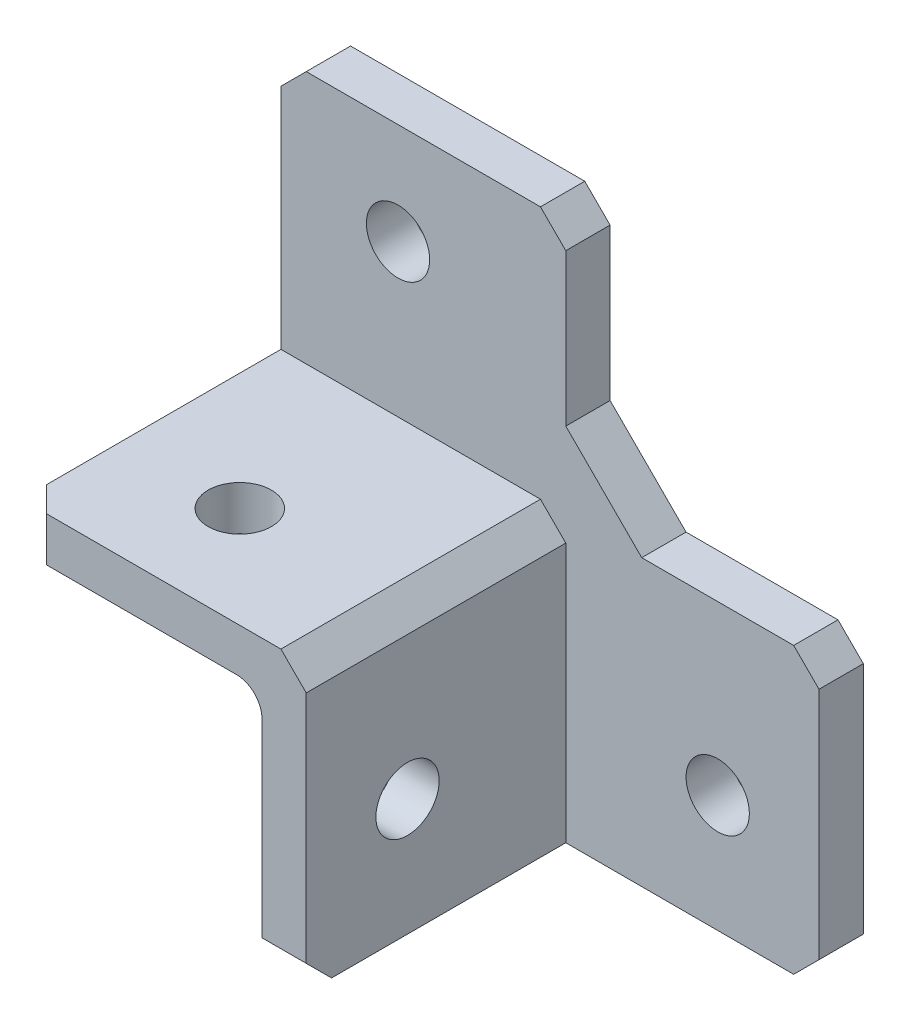
ISO-10303-21;
HEADER;
FILE_DESCRIPTION(('STEP AP214'),'2;1');
FILE_NAME('part.step','',(''),(''),'','','');
FILE_SCHEMA(('AUTOMOTIVE_DESIGN { 1 0 10303 214 1 1 1 1 }'));
ENDSEC;
DATA;
#1=APPLICATION_CONTEXT('core data for automotive mechanical design processes');
#2=APPLICATION_PROTOCOL_DEFINITION('international standard','automotive_design',2000,#1);
#3=PRODUCT_CONTEXT('',#1,'mechanical');
#4=PRODUCT('Part','Part','',(#3));
#5=PRODUCT_RELATED_PRODUCT_CATEGORY('part','',(#4));
#6=PRODUCT_DEFINITION_FORMATION('','',#4);
#7=PRODUCT_DEFINITION_CONTEXT('part definition',#1,'design');
#8=PRODUCT_DEFINITION('design','',#6,#7);
#9=PRODUCT_DEFINITION_SHAPE('','',#8);
#10=(LENGTH_UNIT() NAMED_UNIT(*) SI_UNIT(.MILLI.,.METRE.));
#11=(NAMED_UNIT(*) PLANE_ANGLE_UNIT() SI_UNIT($,.RADIAN.));
#12=(NAMED_UNIT(*) SI_UNIT($,.STERADIAN.) SOLID_ANGLE_UNIT());
#13=UNCERTAINTY_MEASURE_WITH_UNIT(LENGTH_MEASURE(1.E-05),#10,'distance_accuracy_value','');
#14=(GEOMETRIC_REPRESENTATION_CONTEXT(3) GLOBAL_UNCERTAINTY_ASSIGNED_CONTEXT((#13)) GLOBAL_UNIT_ASSIGNED_CONTEXT((#10,
#11,#12)) REPRESENTATION_CONTEXT('',''));
#15=CARTESIAN_POINT('',(0.,0.,0.));
#16=DIRECTION('',(0.,0.,1.));
#17=DIRECTION('',(1.,0.,0.));
#18=AXIS2_PLACEMENT_3D('',#15,#16,#17);
#19=CARTESIAN_POINT('',(0.,-9.82194244604317,3.5));
#20=DIRECTION('',(0.,1.,0.));
#21=DIRECTION('',(0.,0.,1.));
#22=AXIS2_PLACEMENT_3D('',#19,#20,#21);
#23=PLANE('',#22);
#24=CARTESIAN_POINT('',(-36.5266880665871,-9.82194244604317,16.));
#25=DIRECTION('',(0.,1.,0.));
#26=DIRECTION('',(0.,0.,1.));
#27=AXIS2_PLACEMENT_3D('',#24,#25,#26);
#28=CIRCLE('',#27,2.5);
#29=CARTESIAN_POINT('',(-36.5266880665871,-9.82194244604317,18.5));
#30=VERTEX_POINT('',#29);
#31=EDGE_CURVE('E368',#30,#30,#28,.T.);
#32=ORIENTED_EDGE('',*,*,#31,.T.);
#33=EDGE_LOOP('',(#32));
#34=FACE_BOUND('',#33,.T.);
#35=DIRECTION('',(1.,0.,0.));
#36=VECTOR('',#35,1.);
#37=CARTESIAN_POINT('',(0.,-9.82194244604317,0.));
#38=LINE('',#37,#36);
#39=CARTESIAN_POINT('',(-45.7766880665871,-9.82194244604317,0.));
#40=VERTEX_POINT('',#39);
#41=CARTESIAN_POINT('',(-28.7766880665871,-9.82194244604317,0.));
#42=VERTEX_POINT('',#41);
#43=EDGE_CURVE('E184',#40,#42,#38,.T.);
#44=ORIENTED_EDGE('',*,*,#43,.T.);
#45=DIRECTION('',(0.,0.,-1.));
#46=VECTOR('',#45,1.);
#47=CARTESIAN_POINT('',(-28.7766880665871,-9.82194244604317,24.));
#48=LINE('',#47,#46);
#49=CARTESIAN_POINT('',(-28.7766880665871,-9.82194244604317,24.));
#50=VERTEX_POINT('',#49);
#51=EDGE_CURVE('E57',#42,#50,#48,.F.);
#52=ORIENTED_EDGE('',*,*,#51,.T.);
#53=DIRECTION('',(1.,0.,0.));
#54=VECTOR('',#53,1.);
#55=CARTESIAN_POINT('',(0.,-9.82194244604317,24.));
#56=LINE('',#55,#54);
#57=CARTESIAN_POINT('',(-43.7766880665871,-9.82194244604317,24.));
#58=VERTEX_POINT('',#57);
#59=EDGE_CURVE('E370',#58,#50,#56,.T.);
#60=ORIENTED_EDGE('',*,*,#59,.F.);
#61=DIRECTION('',(-0.707106781186545,0.,-0.70710678118655));
#62=VECTOR('',#61,1.);
#63=CARTESIAN_POINT('',(-43.7766880665871,-9.82194244604317,24.));
#64=LINE('',#63,#62);
#65=CARTESIAN_POINT('',(-45.7766880665871,-9.82194244604317,22.));
#66=VERTEX_POINT('',#65);
#67=EDGE_CURVE('E245',#58,#66,#64,.T.);
#68=ORIENTED_EDGE('',*,*,#67,.T.);
#69=DIRECTION('',(0.,0.,-1.));
#70=VECTOR('',#69,1.);
#71=CARTESIAN_POINT('',(-45.7766880665871,-9.82194244604317,3.5));
#72=LINE('',#71,#70);
#73=EDGE_CURVE('E194',#66,#40,#72,.T.);
#74=ORIENTED_EDGE('',*,*,#73,.T.);
#75=EDGE_LOOP('',(#44,#52,#60,#68,#74));
#76=FACE_BOUND('',#75,.T.);
#77=ADVANCED_FACE('F36',(#34,#76),#23,.F.);
#78=CARTESIAN_POINT('',(-26.7766880665871,0.,3.5));
#79=DIRECTION('',(1.,0.,0.));
#80=DIRECTION('',(0.,1.,0.));
#81=AXIS2_PLACEMENT_3D('',#78,#79,#80);
#82=PLANE('',#81);
#83=CARTESIAN_POINT('',(-26.7766880665871,-19.5719424460432,16.));
#84=DIRECTION('',(1.,0.,0.));
#85=DIRECTION('',(0.,0.,-1.));
#86=AXIS2_PLACEMENT_3D('',#83,#84,#85);
#87=CIRCLE('',#86,2.5);
#88=CARTESIAN_POINT('',(-26.7766880665871,-19.5719424460432,13.5));
#89=VERTEX_POINT('',#88);
#90=EDGE_CURVE('E382',#89,#89,#87,.T.);
#91=ORIENTED_EDGE('',*,*,#90,.T.);
#92=EDGE_LOOP('',(#91));
#93=FACE_BOUND('',#92,.T.);
#94=DIRECTION('',(0.,-1.,0.));
#95=VECTOR('',#94,1.);
#96=CARTESIAN_POINT('',(-26.7766880665871,0.,24.));
#97=LINE('',#96,#95);
#98=CARTESIAN_POINT('',(-26.7766880665871,-11.8219424460432,24.));
#99=VERTEX_POINT('',#98);
#100=CARTESIAN_POINT('',(-26.7766880665871,-26.8219424460432,24.));
#101=VERTEX_POINT('',#100);
#102=EDGE_CURVE('E378',#99,#101,#97,.T.);
#103=ORIENTED_EDGE('',*,*,#102,.F.);
#104=DIRECTION('',(0.,0.,-1.));
#105=VECTOR('',#104,1.);
#106=CARTESIAN_POINT('',(-26.7766880665871,-11.8219424460432,0.));
#107=LINE('',#106,#105);
#108=CARTESIAN_POINT('',(-26.7766880665871,-11.8219424460432,0.));
#109=VERTEX_POINT('',#108);
#110=EDGE_CURVE('E181',#99,#109,#107,.T.);
#111=ORIENTED_EDGE('',*,*,#110,.T.);
#112=DIRECTION('',(0.,-1.,0.));
#113=VECTOR('',#112,1.);
#114=CARTESIAN_POINT('',(-26.7766880665871,0.,0.));
#115=LINE('',#114,#113);
#116=CARTESIAN_POINT('',(-26.7766880665871,-28.8219424460432,0.));
#117=VERTEX_POINT('',#116);
#118=EDGE_CURVE('E173',#109,#117,#115,.T.);
#119=ORIENTED_EDGE('',*,*,#118,.T.);
#120=DIRECTION('',(0.,0.,-1.));
#121=VECTOR('',#120,1.);
#122=CARTESIAN_POINT('',(-26.7766880665871,-28.8219424460432,3.5));
#123=LINE('',#122,#121);
#124=CARTESIAN_POINT('',(-26.7766880665871,-28.8219424460432,22.));
#125=VERTEX_POINT('',#124);
#126=EDGE_CURVE('E178',#125,#117,#123,.T.);
#127=ORIENTED_EDGE('',*,*,#126,.F.);
#128=DIRECTION('',(0.,0.707106781186545,0.70710678118655));
#129=VECTOR('',#128,1.);
#130=CARTESIAN_POINT('',(-26.7766880665871,-26.8219424460432,24.));
#131=LINE('',#130,#129);
#132=EDGE_CURVE('E259',#125,#101,#131,.T.);
#133=ORIENTED_EDGE('',*,*,#132,.T.);
#134=EDGE_LOOP('',(#103,#111,#119,#127,#133));
#135=FACE_BOUND('',#134,.T.);
#136=ADVANCED_FACE('F176',(#93,#135),#82,.F.);
#137=CARTESIAN_POINT('',(0.,-28.8219424460432,3.5));
#138=DIRECTION('',(0.,1.,0.));
#139=DIRECTION('',(0.,0.,1.));
#140=AXIS2_PLACEMENT_3D('',#137,#138,#139);
#141=PLANE('',#140);
#142=DIRECTION('',(0.,0.,-1.));
#143=VECTOR('',#142,1.);
#144=CARTESIAN_POINT('',(-23.2766880665871,-28.8219424460432,24.));
#145=LINE('',#144,#143);
#146=CARTESIAN_POINT('',(-23.2766880665871,-28.8219424460432,22.));
#147=VERTEX_POINT('',#146);
#148=CARTESIAN_POINT('',(-23.2766880665871,-28.8219424460432,3.5));
#149=VERTEX_POINT('',#148);
#150=EDGE_CURVE('E332',#147,#149,#145,.T.);
#151=ORIENTED_EDGE('',*,*,#150,.F.);
#152=DIRECTION('',(-1.,0.,0.));
#153=VECTOR('',#152,1.);
#154=CARTESIAN_POINT('',(-26.7766880665871,-28.8219424460432,22.));
#155=LINE('',#154,#153);
#156=EDGE_CURVE('E192',#147,#125,#155,.T.);
#157=ORIENTED_EDGE('',*,*,#156,.T.);
#158=ORIENTED_EDGE('',*,*,#126,.T.);
#159=DIRECTION('',(1.,0.,0.));
#160=VECTOR('',#159,1.);
#161=CARTESIAN_POINT('',(0.,-28.8219424460432,0.));
#162=LINE('',#161,#160);
#163=CARTESIAN_POINT('',(-5.27668806658711,-28.8219424460432,0.));
#164=VERTEX_POINT('',#163);
#165=EDGE_CURVE('E183',#117,#164,#162,.T.);
#166=ORIENTED_EDGE('',*,*,#165,.T.);
#167=DIRECTION('',(0.,0.,1.));
#168=VECTOR('',#167,1.);
#169=CARTESIAN_POINT('',(-5.27668806658711,-28.8219424460432,3.5));
#170=LINE('',#169,#168);
#171=CARTESIAN_POINT('',(-5.27668806658711,-28.8219424460432,3.5));
#172=VERTEX_POINT('',#171);
#173=EDGE_CURVE('E256',#164,#172,#170,.T.);
#174=ORIENTED_EDGE('',*,*,#173,.T.);
#175=DIRECTION('',(1.,0.,0.));
#176=VECTOR('',#175,1.);
#177=CARTESIAN_POINT('',(0.,-28.8219424460432,3.5));
#178=LINE('',#177,#176);
#179=EDGE_CURVE('E215',#149,#172,#178,.T.);
#180=ORIENTED_EDGE('',*,*,#179,.F.);
#181=EDGE_LOOP('',(#151,#157,#158,#166,#174,#180));
#182=FACE_BOUND('',#181,.T.);
#183=ADVANCED_FACE('F189',(#182),#141,.F.);
#184=CARTESIAN_POINT('',(-3.27668806658711,0.,3.5));
#185=DIRECTION('',(1.,0.,0.));
#186=DIRECTION('',(0.,1.,0.));
#187=AXIS2_PLACEMENT_3D('',#184,#185,#186);
#188=PLANE('',#187);
#189=DIRECTION('',(0.,-1.,0.));
#190=VECTOR('',#189,1.);
#191=CARTESIAN_POINT('',(-3.27668806658711,0.,3.5));
#192=LINE('',#191,#190);
#193=CARTESIAN_POINT('',(-3.27668806658711,-8.32194244604319,3.5));
#194=VERTEX_POINT('',#193);
#195=CARTESIAN_POINT('',(-3.27668806658711,-26.8219424460432,3.5));
#196=VERTEX_POINT('',#195);
#197=EDGE_CURVE('E343',#194,#196,#192,.T.);
#198=ORIENTED_EDGE('',*,*,#197,.T.);
#199=DIRECTION('',(0.,0.,-1.));
#200=VECTOR('',#199,1.);
#201=CARTESIAN_POINT('',(-3.27668806658711,-26.8219424460432,0.));
#202=LINE('',#201,#200);
#203=CARTESIAN_POINT('',(-3.27668806658711,-26.8219424460432,0.));
#204=VERTEX_POINT('',#203);
#205=EDGE_CURVE('E283',#196,#204,#202,.T.);
#206=ORIENTED_EDGE('',*,*,#205,.T.);
#207=DIRECTION('',(0.,-1.,0.));
#208=VECTOR('',#207,1.);
#209=CARTESIAN_POINT('',(-3.27668806658711,0.,0.));
#210=LINE('',#209,#208);
#211=CARTESIAN_POINT('',(-3.27668806658711,-8.32194244604319,0.));
#212=VERTEX_POINT('',#211);
#213=EDGE_CURVE('E200',#212,#204,#210,.T.);
#214=ORIENTED_EDGE('',*,*,#213,.F.);
#215=DIRECTION('',(0.,0.,1.));
#216=VECTOR('',#215,1.);
#217=CARTESIAN_POINT('',(-3.27668806658711,-8.32194244604319,3.5));
#218=LINE('',#217,#216);
#219=EDGE_CURVE('E281',#212,#194,#218,.T.);
#220=ORIENTED_EDGE('',*,*,#219,.T.);
#221=EDGE_LOOP('',(#198,#206,#214,#220));
#222=FACE_BOUND('',#221,.T.);
#223=ADVANCED_FACE('F358',(#222),#188,.T.);
#224=CARTESIAN_POINT('',(0.,-6.32194244604317,3.5));
#225=DIRECTION('',(0.,1.,0.));
#226=DIRECTION('',(0.,0.,1.));
#227=AXIS2_PLACEMENT_3D('',#224,#225,#226);
#228=PLANE('',#227);
#229=DIRECTION('',(1.,0.,0.));
#230=VECTOR('',#229,1.);
#231=CARTESIAN_POINT('',(0.,-6.32194244604317,3.5));
#232=LINE('',#231,#230);
#233=CARTESIAN_POINT('',(-17.2766880665871,-6.32194244604317,3.5));
#234=VERTEX_POINT('',#233);
#235=CARTESIAN_POINT('',(-5.27668806658712,-6.32194244604317,3.5));
#236=VERTEX_POINT('',#235);
#237=EDGE_CURVE('E309',#234,#236,#232,.T.);
#238=ORIENTED_EDGE('',*,*,#237,.T.);
#239=DIRECTION('',(0.,0.,-1.));
#240=VECTOR('',#239,1.);
#241=CARTESIAN_POINT('',(-5.27668806658712,-6.32194244604317,3.5));
#242=LINE('',#241,#240);
#243=CARTESIAN_POINT('',(-5.27668806658712,-6.32194244604317,0.));
#244=VERTEX_POINT('',#243);
#245=EDGE_CURVE('E286',#236,#244,#242,.T.);
#246=ORIENTED_EDGE('',*,*,#245,.T.);
#247=DIRECTION('',(1.,0.,0.));
#248=VECTOR('',#247,1.);
#249=CARTESIAN_POINT('',(0.,-6.32194244604317,0.));
#250=LINE('',#249,#248);
#251=CARTESIAN_POINT('',(-17.2766880665871,-6.32194244604317,0.));
#252=VERTEX_POINT('',#251);
#253=EDGE_CURVE('E202',#252,#244,#250,.T.);
#254=ORIENTED_EDGE('',*,*,#253,.F.);
#255=DIRECTION('',(0.,0.,1.));
#256=VECTOR('',#255,1.);
#257=CARTESIAN_POINT('',(-17.2766880665871,-6.32194244604317,3.5));
#258=LINE('',#257,#256);
#259=EDGE_CURVE('E221',#252,#234,#258,.T.);
#260=ORIENTED_EDGE('',*,*,#259,.T.);
#261=EDGE_LOOP('',(#238,#246,#254,#260));
#262=FACE_BOUND('',#261,.T.);
#263=ADVANCED_FACE('F349',(#262),#228,.T.);
#264=CARTESIAN_POINT('',(-23.2766880665871,0.,3.5));
#265=DIRECTION('',(1.,0.,0.));
#266=DIRECTION('',(0.,1.,0.));
#267=AXIS2_PLACEMENT_3D('',#264,#265,#266);
#268=PLANE('',#267);
#269=DIRECTION('',(0.,-1.,0.));
#270=VECTOR('',#269,1.);
#271=CARTESIAN_POINT('',(-23.2766880665871,0.,0.));
#272=LINE('',#271,#270);
#273=CARTESIAN_POINT('',(-23.2766880665871,11.6780575539568,0.));
#274=VERTEX_POINT('',#273);
#275=CARTESIAN_POINT('',(-23.2766880665871,-0.321942446043114,0.));
#276=VERTEX_POINT('',#275);
#277=EDGE_CURVE('E208',#274,#276,#272,.T.);
#278=ORIENTED_EDGE('',*,*,#277,.F.);
#279=DIRECTION('',(0.,0.,1.));
#280=VECTOR('',#279,1.);
#281=CARTESIAN_POINT('',(-23.2766880665871,11.6780575539568,3.5));
#282=LINE('',#281,#280);
#283=CARTESIAN_POINT('',(-23.2766880665871,11.6780575539568,3.5));
#284=VERTEX_POINT('',#283);
#285=EDGE_CURVE('E289',#274,#284,#282,.T.);
#286=ORIENTED_EDGE('',*,*,#285,.T.);
#287=DIRECTION('',(0.,-1.,0.));
#288=VECTOR('',#287,1.);
#289=CARTESIAN_POINT('',(-23.2766880665871,0.,3.5));
#290=LINE('',#289,#288);
#291=CARTESIAN_POINT('',(-23.2766880665871,-0.321942446043114,3.5));
#292=VERTEX_POINT('',#291);
#293=EDGE_CURVE('E297',#284,#292,#290,.T.);
#294=ORIENTED_EDGE('',*,*,#293,.T.);
#295=DIRECTION('',(0.,0.,-1.));
#296=VECTOR('',#295,1.);
#297=CARTESIAN_POINT('',(-23.2766880665871,-0.321942446043114,0.));
#298=LINE('',#297,#296);
#299=EDGE_CURVE('E193',#292,#276,#298,.T.);
#300=ORIENTED_EDGE('',*,*,#299,.T.);
#301=EDGE_LOOP('',(#278,#286,#294,#300));
#302=FACE_BOUND('',#301,.T.);
#303=ADVANCED_FACE('F296',(#302),#268,.T.);
#304=CARTESIAN_POINT('',(0.,13.6780575539568,3.5));
#305=DIRECTION('',(0.,1.,0.));
#306=DIRECTION('',(0.,0.,1.));
#307=AXIS2_PLACEMENT_3D('',#304,#305,#306);
#308=PLANE('',#307);
#309=DIRECTION('',(1.,0.,0.));
#310=VECTOR('',#309,1.);
#311=CARTESIAN_POINT('',(0.,13.6780575539568,0.));
#312=LINE('',#311,#310);
#313=CARTESIAN_POINT('',(-43.7766880665871,13.6780575539568,0.));
#314=VERTEX_POINT('',#313);
#315=CARTESIAN_POINT('',(-25.2766880665871,13.6780575539568,0.));
#316=VERTEX_POINT('',#315);
#317=EDGE_CURVE('E210',#314,#316,#312,.T.);
#318=ORIENTED_EDGE('',*,*,#317,.F.);
#319=DIRECTION('',(0.,0.,1.));
#320=VECTOR('',#319,1.);
#321=CARTESIAN_POINT('',(-43.7766880665871,13.6780575539568,3.5));
#322=LINE('',#321,#320);
#323=CARTESIAN_POINT('',(-43.7766880665871,13.6780575539568,3.5));
#324=VERTEX_POINT('',#323);
#325=EDGE_CURVE('E271',#314,#324,#322,.T.);
#326=ORIENTED_EDGE('',*,*,#325,.T.);
#327=DIRECTION('',(1.,0.,0.));
#328=VECTOR('',#327,1.);
#329=CARTESIAN_POINT('',(0.,13.6780575539568,3.5));
#330=LINE('',#329,#328);
#331=CARTESIAN_POINT('',(-25.2766880665871,13.6780575539568,3.5));
#332=VERTEX_POINT('',#331);
#333=EDGE_CURVE('E308',#324,#332,#330,.T.);
#334=ORIENTED_EDGE('',*,*,#333,.T.);
#335=DIRECTION('',(0.,0.,-1.));
#336=VECTOR('',#335,1.);
#337=CARTESIAN_POINT('',(-25.2766880665871,13.6780575539568,3.5));
#338=LINE('',#337,#336);
#339=EDGE_CURVE('E268',#332,#316,#338,.T.);
#340=ORIENTED_EDGE('',*,*,#339,.T.);
#341=EDGE_LOOP('',(#318,#326,#334,#340));
#342=FACE_BOUND('',#341,.T.);
#343=ADVANCED_FACE('F315',(#342),#308,.T.);
#344=CARTESIAN_POINT('',(-45.7766880665871,0.,3.5));
#345=DIRECTION('',(1.,0.,0.));
#346=DIRECTION('',(0.,0.,-1.));
#347=AXIS2_PLACEMENT_3D('',#344,#345,#346);
#348=PLANE('',#347);
#349=ORIENTED_EDGE('',*,*,#73,.F.);
#350=DIRECTION('',(0.,1.,0.));
#351=VECTOR('',#350,1.);
#352=CARTESIAN_POINT('',(-45.7766880665871,-6.32194244604317,22.));
#353=LINE('',#352,#351);
#354=CARTESIAN_POINT('',(-45.7766880665871,-6.32194244604317,22.));
#355=VERTEX_POINT('',#354);
#356=EDGE_CURVE('E250',#66,#355,#353,.T.);
#357=ORIENTED_EDGE('',*,*,#356,.T.);
#358=DIRECTION('',(0.,0.,-1.));
#359=VECTOR('',#358,1.);
#360=CARTESIAN_POINT('',(-45.7766880665871,-6.32194244604317,24.));
#361=LINE('',#360,#359);
#362=CARTESIAN_POINT('',(-45.7766880665871,-6.32194244604317,3.5));
#363=VERTEX_POINT('',#362);
#364=EDGE_CURVE('E327',#355,#363,#361,.T.);
#365=ORIENTED_EDGE('',*,*,#364,.T.);
#366=DIRECTION('',(0.,-1.,0.));
#367=VECTOR('',#366,1.);
#368=CARTESIAN_POINT('',(-45.7766880665871,0.,3.5));
#369=LINE('',#368,#367);
#370=CARTESIAN_POINT('',(-45.7766880665871,11.6780575539568,3.5));
#371=VERTEX_POINT('',#370);
#372=EDGE_CURVE('E217',#371,#363,#369,.T.);
#373=ORIENTED_EDGE('',*,*,#372,.F.);
#374=DIRECTION('',(0.,0.,-1.));
#375=VECTOR('',#374,1.);
#376=CARTESIAN_POINT('',(-45.7766880665871,11.6780575539568,0.));
#377=LINE('',#376,#375);
#378=CARTESIAN_POINT('',(-45.7766880665871,11.6780575539568,0.));
#379=VERTEX_POINT('',#378);
#380=EDGE_CURVE('E247',#371,#379,#377,.T.);
#381=ORIENTED_EDGE('',*,*,#380,.T.);
#382=DIRECTION('',(0.,-1.,0.));
#383=VECTOR('',#382,1.);
#384=CARTESIAN_POINT('',(-45.7766880665871,0.,0.));
#385=LINE('',#384,#383);
#386=EDGE_CURVE('E213',#379,#40,#385,.T.);
#387=ORIENTED_EDGE('',*,*,#386,.T.);
#388=EDGE_LOOP('',(#349,#357,#365,#373,#381,#387));
#389=FACE_BOUND('',#388,.T.);
#390=ADVANCED_FACE('F324',(#389),#348,.F.);
#391=CARTESIAN_POINT('',(0.,0.,3.5));
#392=DIRECTION('',(0.,0.,1.));
#393=DIRECTION('',(1.,0.,0.));
#394=AXIS2_PLACEMENT_3D('',#391,#392,#393);
#395=PLANE('',#394);
#396=CARTESIAN_POINT('',(-11.2766880665871,-19.5719424460432,3.5));
#397=DIRECTION('',(0.,0.,1.));
#398=DIRECTION('',(1.,0.,0.));
#399=AXIS2_PLACEMENT_3D('',#396,#397,#398);
#400=CIRCLE('',#399,2.5);
#401=CARTESIAN_POINT('',(-8.77668806658711,-19.5719424460432,3.5));
#402=VERTEX_POINT('',#401);
#403=EDGE_CURVE('E396',#402,#402,#400,.T.);
#404=ORIENTED_EDGE('',*,*,#403,.F.);
#405=EDGE_LOOP('',(#404));
#406=FACE_BOUND('',#405,.T.);
#407=ORIENTED_EDGE('',*,*,#333,.F.);
#408=DIRECTION('',(-0.70710678118655,-0.707106781186545,0.));
#409=VECTOR('',#408,1.);
#410=CARTESIAN_POINT('',(-28.7273728102718,28.727372810272,3.5));
#411=LINE('',#410,#409);
#412=EDGE_CURVE('E279',#324,#371,#411,.T.);
#413=ORIENTED_EDGE('',*,*,#412,.T.);
#414=ORIENTED_EDGE('',*,*,#372,.T.);
#415=DIRECTION('',(1.,0.,0.));
#416=VECTOR('',#415,1.);
#417=CARTESIAN_POINT('',(0.,-6.32194244604317,3.5));
#418=LINE('',#417,#416);
#419=CARTESIAN_POINT('',(-25.2766880665871,-6.32194244604317,3.5));
#420=VERTEX_POINT('',#419);
#421=EDGE_CURVE('E367',#363,#420,#418,.T.);
#422=ORIENTED_EDGE('',*,*,#421,.T.);
#423=DIRECTION('',(0.707106781186545,-0.70710678118655,0.));
#424=VECTOR('',#423,1.);
#425=CARTESIAN_POINT('',(-25.2766880665871,-6.32194244604317,3.5));
#426=LINE('',#425,#424);
#427=CARTESIAN_POINT('',(-23.2766880665871,-8.32194244604319,3.5));
#428=VERTEX_POINT('',#427);
#429=EDGE_CURVE('E237',#420,#428,#426,.T.);
#430=ORIENTED_EDGE('',*,*,#429,.T.);
#431=DIRECTION('',(0.,1.,0.));
#432=VECTOR('',#431,1.);
#433=CARTESIAN_POINT('',(-23.2766880665871,0.,3.5));
#434=LINE('',#433,#432);
#435=EDGE_CURVE('E365',#149,#428,#434,.T.);
#436=ORIENTED_EDGE('',*,*,#435,.F.);
#437=ORIENTED_EDGE('',*,*,#179,.T.);
#438=DIRECTION('',(0.70710678118655,0.707106781186545,0.));
#439=VECTOR('',#438,1.);
#440=CARTESIAN_POINT('',(11.772627189728,-11.7726271897281,3.5));
#441=LINE('',#440,#439);
#442=EDGE_CURVE('E277',#172,#196,#441,.T.);
#443=ORIENTED_EDGE('',*,*,#442,.T.);
#444=ORIENTED_EDGE('',*,*,#197,.F.);
#445=DIRECTION('',(0.707106781186545,-0.70710678118655,0.));
#446=VECTOR('',#445,1.);
#447=CARTESIAN_POINT('',(-5.79931525631516,-5.79931525631512,3.5));
#448=LINE('',#447,#446);
#449=EDGE_CURVE('E275',#194,#236,#448,.F.);
#450=ORIENTED_EDGE('',*,*,#449,.T.);
#451=ORIENTED_EDGE('',*,*,#237,.F.);
#452=DIRECTION('',(0.707106781186544,-0.707106781186551,0.));
#453=VECTOR('',#452,1.);
#454=CARTESIAN_POINT('',(-23.2766880665871,-0.321942446043114,3.5));
#455=LINE('',#454,#453);
#456=EDGE_CURVE('E225',#234,#292,#455,.F.);
#457=ORIENTED_EDGE('',*,*,#456,.T.);
#458=ORIENTED_EDGE('',*,*,#293,.F.);
#459=DIRECTION('',(0.707106781186545,-0.70710678118655,0.));
#460=VECTOR('',#459,1.);
#461=CARTESIAN_POINT('',(-5.79931525631523,-5.79931525631519,3.5));
#462=LINE('',#461,#460);
#463=EDGE_CURVE('E273',#284,#332,#462,.F.);
#464=ORIENTED_EDGE('',*,*,#463,.T.);
#465=EDGE_LOOP('',(#407,#413,#414,#422,#430,#436,#437,#443,#444,#450,#451,#457,#458,#464));
#466=FACE_BOUND('',#465,.T.);
#467=CARTESIAN_POINT('',(-36.5266880665871,5.67805755395683,3.5));
#468=DIRECTION('',(0.,0.,1.));
#469=DIRECTION('',(1.,0.,0.));
#470=AXIS2_PLACEMENT_3D('',#467,#468,#469);
#471=CIRCLE('',#470,2.49999999999999);
#472=CARTESIAN_POINT('',(-34.0266880665871,5.67805755395683,3.5));
#473=VERTEX_POINT('',#472);
#474=EDGE_CURVE('E390',#473,#473,#471,.T.);
#475=ORIENTED_EDGE('',*,*,#474,.F.);
#476=EDGE_LOOP('',(#475));
#477=FACE_BOUND('',#476,.T.);
#478=ADVANCED_FACE('F302',(#406,#466,#477),#395,.T.);
#479=CARTESIAN_POINT('',(0.,0.,0.));
#480=DIRECTION('',(0.,0.,1.));
#481=DIRECTION('',(1.,0.,0.));
#482=AXIS2_PLACEMENT_3D('',#479,#480,#481);
#483=PLANE('',#482);
#484=CARTESIAN_POINT('',(-11.2766880665871,-19.5719424460432,0.));
#485=DIRECTION('',(0.,0.,1.));
#486=DIRECTION('',(1.,0.,0.));
#487=AXIS2_PLACEMENT_3D('',#484,#485,#486);
#488=CIRCLE('',#487,2.5);
#489=CARTESIAN_POINT('',(-8.77668806658711,-19.5719424460432,0.));
#490=VERTEX_POINT('',#489);
#491=EDGE_CURVE('E393',#490,#490,#488,.T.);
#492=ORIENTED_EDGE('',*,*,#491,.T.);
#493=EDGE_LOOP('',(#492));
#494=FACE_BOUND('',#493,.T.);
#495=CARTESIAN_POINT('',(-36.5266880665871,5.67805755395683,0.));
#496=DIRECTION('',(0.,0.,1.));
#497=DIRECTION('',(1.,0.,0.));
#498=AXIS2_PLACEMENT_3D('',#495,#496,#497);
#499=CIRCLE('',#498,2.49999999999999);
#500=CARTESIAN_POINT('',(-34.0266880665871,5.67805755395683,0.));
#501=VERTEX_POINT('',#500);
#502=EDGE_CURVE('E387',#501,#501,#499,.T.);
#503=ORIENTED_EDGE('',*,*,#502,.T.);
#504=EDGE_LOOP('',(#503));
#505=FACE_BOUND('',#504,.T.);
#506=ORIENTED_EDGE('',*,*,#386,.F.);
#507=DIRECTION('',(0.70710678118655,0.707106781186545,0.));
#508=VECTOR('',#507,1.);
#509=CARTESIAN_POINT('',(-45.7766880665871,11.6780575539568,0.));
#510=LINE('',#509,#508);
#511=EDGE_CURVE('E266',#379,#314,#510,.T.);
#512=ORIENTED_EDGE('',*,*,#511,.T.);
#513=ORIENTED_EDGE('',*,*,#317,.T.);
#514=DIRECTION('',(-0.707106781186545,0.70710678118655,0.));
#515=VECTOR('',#514,1.);
#516=CARTESIAN_POINT('',(-25.2766880665871,13.6780575539568,0.));
#517=LINE('',#516,#515);
#518=EDGE_CURVE('E261',#316,#274,#517,.F.);
#519=ORIENTED_EDGE('',*,*,#518,.T.);
#520=ORIENTED_EDGE('',*,*,#277,.T.);
#521=DIRECTION('',(-0.707106781186544,0.707106781186551,0.));
#522=VECTOR('',#521,1.);
#523=CARTESIAN_POINT('',(-11.7993152563152,-11.7993152563151,0.));
#524=LINE('',#523,#522);
#525=EDGE_CURVE('E223',#276,#252,#524,.F.);
#526=ORIENTED_EDGE('',*,*,#525,.T.);
#527=ORIENTED_EDGE('',*,*,#253,.T.);
#528=DIRECTION('',(-0.707106781186545,0.70710678118655,0.));
#529=VECTOR('',#528,1.);
#530=CARTESIAN_POINT('',(-5.27668806658712,-6.32194244604317,0.));
#531=LINE('',#530,#529);
#532=EDGE_CURVE('E263',#244,#212,#531,.F.);
#533=ORIENTED_EDGE('',*,*,#532,.T.);
#534=ORIENTED_EDGE('',*,*,#213,.T.);
#535=DIRECTION('',(-0.70710678118655,-0.707106781186545,0.));
#536=VECTOR('',#535,1.);
#537=CARTESIAN_POINT('',(-3.27668806658711,-26.8219424460432,0.));
#538=LINE('',#537,#536);
#539=EDGE_CURVE('E199',#204,#164,#538,.T.);
#540=ORIENTED_EDGE('',*,*,#539,.T.);
#541=ORIENTED_EDGE('',*,*,#165,.F.);
#542=ORIENTED_EDGE('',*,*,#118,.F.);
#543=CARTESIAN_POINT('',(-28.7766880665871,-11.8219424460432,0.));
#544=DIRECTION('',(0.,0.,1.));
#545=DIRECTION('',(1.,0.,0.));
#546=AXIS2_PLACEMENT_3D('',#543,#544,#545);
#547=CIRCLE('',#546,2.);
#548=EDGE_CURVE('E44',#109,#42,#547,.T.);
#549=ORIENTED_EDGE('',*,*,#548,.T.);
#550=ORIENTED_EDGE('',*,*,#43,.F.);
#551=EDGE_LOOP('',(#506,#512,#513,#519,#520,#526,#527,#533,#534,#540,#541,#542,#549,#550));
#552=FACE_BOUND('',#551,.T.);
#553=ADVANCED_FACE('F197',(#494,#505,#552),#483,.F.);
#554=CARTESIAN_POINT('',(-23.2766880665871,0.,24.));
#555=DIRECTION('',(-1.,0.,0.));
#556=DIRECTION('',(0.,0.,1.));
#557=AXIS2_PLACEMENT_3D('',#554,#555,#556);
#558=PLANE('',#557);
#559=CARTESIAN_POINT('',(-23.2766880665871,-19.5719424460432,16.));
#560=DIRECTION('',(1.,0.,0.));
#561=DIRECTION('',(0.,0.,-1.));
#562=AXIS2_PLACEMENT_3D('',#559,#560,#561);
#563=CIRCLE('',#562,2.5);
#564=CARTESIAN_POINT('',(-23.2766880665871,-19.5719424460432,13.5));
#565=VERTEX_POINT('',#564);
#566=EDGE_CURVE('E384',#565,#565,#563,.T.);
#567=ORIENTED_EDGE('',*,*,#566,.F.);
#568=EDGE_LOOP('',(#567));
#569=FACE_BOUND('',#568,.T.);
#570=DIRECTION('',(0.,1.,0.));
#571=VECTOR('',#570,1.);
#572=CARTESIAN_POINT('',(-23.2766880665871,0.,24.));
#573=LINE('',#572,#571);
#574=CARTESIAN_POINT('',(-23.2766880665871,-26.8219424460432,24.));
#575=VERTEX_POINT('',#574);
#576=CARTESIAN_POINT('',(-23.2766880665871,-8.32194244604319,24.));
#577=VERTEX_POINT('',#576);
#578=EDGE_CURVE('E376',#575,#577,#573,.T.);
#579=ORIENTED_EDGE('',*,*,#578,.F.);
#580=DIRECTION('',(0.,-0.707106781186545,-0.70710678118655));
#581=VECTOR('',#580,1.);
#582=CARTESIAN_POINT('',(-23.2766880665871,-26.8219424460432,24.));
#583=LINE('',#582,#581);
#584=EDGE_CURVE('E254',#575,#147,#583,.T.);
#585=ORIENTED_EDGE('',*,*,#584,.T.);
#586=ORIENTED_EDGE('',*,*,#150,.T.);
#587=ORIENTED_EDGE('',*,*,#435,.T.);
#588=DIRECTION('',(0.,0.,1.));
#589=VECTOR('',#588,1.);
#590=CARTESIAN_POINT('',(-23.2766880665871,-8.32194244604319,24.));
#591=LINE('',#590,#589);
#592=EDGE_CURVE('E231',#428,#577,#591,.T.);
#593=ORIENTED_EDGE('',*,*,#592,.T.);
#594=EDGE_LOOP('',(#579,#585,#586,#587,#593));
#595=FACE_BOUND('',#594,.T.);
#596=ADVANCED_FACE('F418',(#569,#595),#558,.F.);
#597=CARTESIAN_POINT('',(0.,-6.32194244604317,24.));
#598=DIRECTION('',(0.,1.,0.));
#599=DIRECTION('',(0.,0.,1.));
#600=AXIS2_PLACEMENT_3D('',#597,#598,#599);
#601=PLANE('',#600);
#602=CARTESIAN_POINT('',(-36.5266880665871,-6.32194244604317,16.));
#603=DIRECTION('',(0.,1.,0.));
#604=DIRECTION('',(0.,0.,1.));
#605=AXIS2_PLACEMENT_3D('',#602,#603,#604);
#606=CIRCLE('',#605,2.5);
#607=CARTESIAN_POINT('',(-36.5266880665871,-6.32194244604317,18.5));
#608=VERTEX_POINT('',#607);
#609=EDGE_CURVE('E372',#608,#608,#606,.T.);
#610=ORIENTED_EDGE('',*,*,#609,.F.);
#611=EDGE_LOOP('',(#610));
#612=FACE_BOUND('',#611,.T.);
#613=ORIENTED_EDGE('',*,*,#364,.F.);
#614=DIRECTION('',(0.707106781186545,0.,0.70710678118655));
#615=VECTOR('',#614,1.);
#616=CARTESIAN_POINT('',(-21.8883440332937,-6.32194244604317,45.8883440332935));
#617=LINE('',#616,#615);
#618=CARTESIAN_POINT('',(-43.7766880665871,-6.32194244604317,24.));
#619=VERTEX_POINT('',#618);
#620=EDGE_CURVE('E252',#355,#619,#617,.T.);
#621=ORIENTED_EDGE('',*,*,#620,.T.);
#622=DIRECTION('',(1.,0.,0.));
#623=VECTOR('',#622,1.);
#624=CARTESIAN_POINT('',(0.,-6.32194244604317,24.));
#625=LINE('',#624,#623);
#626=CARTESIAN_POINT('',(-25.2766880665871,-6.32194244604317,24.));
#627=VERTEX_POINT('',#626);
#628=EDGE_CURVE('E337',#619,#627,#625,.T.);
#629=ORIENTED_EDGE('',*,*,#628,.T.);
#630=DIRECTION('',(0.,0.,-1.));
#631=VECTOR('',#630,1.);
#632=CARTESIAN_POINT('',(-25.2766880665871,-6.32194244604317,3.5));
#633=LINE('',#632,#631);
#634=EDGE_CURVE('E228',#627,#420,#633,.T.);
#635=ORIENTED_EDGE('',*,*,#634,.T.);
#636=ORIENTED_EDGE('',*,*,#421,.F.);
#637=EDGE_LOOP('',(#613,#621,#629,#635,#636));
#638=FACE_BOUND('',#637,.T.);
#639=ADVANCED_FACE('F471',(#612,#638),#601,.T.);
#640=CARTESIAN_POINT('',(0.,0.,24.));
#641=DIRECTION('',(0.,0.,1.));
#642=DIRECTION('',(1.,0.,0.));
#643=AXIS2_PLACEMENT_3D('',#640,#641,#642);
#644=PLANE('',#643);
#645=ORIENTED_EDGE('',*,*,#628,.F.);
#646=DIRECTION('',(0.,-1.,0.));
#647=VECTOR('',#646,1.);
#648=CARTESIAN_POINT('',(-43.7766880665871,-9.82194244604317,24.));
#649=LINE('',#648,#647);
#650=EDGE_CURVE('E242',#619,#58,#649,.T.);
#651=ORIENTED_EDGE('',*,*,#650,.T.);
#652=ORIENTED_EDGE('',*,*,#59,.T.);
#653=CARTESIAN_POINT('',(-28.7766880665871,-11.8219424460432,24.));
#654=DIRECTION('',(0.,0.,1.));
#655=DIRECTION('',(1.,0.,0.));
#656=AXIS2_PLACEMENT_3D('',#653,#654,#655);
#657=CIRCLE('',#656,2.);
#658=EDGE_CURVE('E11',#50,#99,#657,.F.);
#659=ORIENTED_EDGE('',*,*,#658,.T.);
#660=ORIENTED_EDGE('',*,*,#102,.T.);
#661=DIRECTION('',(1.,0.,0.));
#662=VECTOR('',#661,1.);
#663=CARTESIAN_POINT('',(-23.2766880665871,-26.8219424460432,24.));
#664=LINE('',#663,#662);
#665=EDGE_CURVE('E239',#101,#575,#664,.T.);
#666=ORIENTED_EDGE('',*,*,#665,.T.);
#667=ORIENTED_EDGE('',*,*,#578,.T.);
#668=DIRECTION('',(-0.707106781186545,0.70710678118655,0.));
#669=VECTOR('',#668,1.);
#670=CARTESIAN_POINT('',(-15.7993152563152,-15.7993152563151,24.));
#671=LINE('',#670,#669);
#672=EDGE_CURVE('E234',#577,#627,#671,.T.);
#673=ORIENTED_EDGE('',*,*,#672,.T.);
#674=EDGE_LOOP('',(#645,#651,#652,#659,#660,#666,#667,#673));
#675=FACE_BOUND('',#674,.T.);
#676=ADVANCED_FACE('F462',(#675),#644,.T.);
#677=CARTESIAN_POINT('',(-36.5266880665871,-9.82194244604317,16.));
#678=DIRECTION('',(0.,1.,0.));
#679=DIRECTION('',(0.,0.,1.));
#680=AXIS2_PLACEMENT_3D('',#677,#678,#679);
#681=CYLINDRICAL_SURFACE('',#680,2.5);
#682=ORIENTED_EDGE('',*,*,#31,.F.);
#683=EDGE_LOOP('',(#682));
#684=FACE_BOUND('',#683,.T.);
#685=ORIENTED_EDGE('',*,*,#609,.T.);
#686=EDGE_LOOP('',(#685));
#687=FACE_BOUND('',#686,.T.);
#688=ADVANCED_FACE('F479',(#684,#687),#681,.F.);
#689=CARTESIAN_POINT('',(-26.7766880665871,-19.5719424460432,16.));
#690=DIRECTION('',(1.,0.,0.));
#691=DIRECTION('',(0.,0.,-1.));
#692=AXIS2_PLACEMENT_3D('',#689,#690,#691);
#693=CYLINDRICAL_SURFACE('',#692,2.5);
#694=ORIENTED_EDGE('',*,*,#90,.F.);
#695=EDGE_LOOP('',(#694));
#696=FACE_BOUND('',#695,.T.);
#697=ORIENTED_EDGE('',*,*,#566,.T.);
#698=EDGE_LOOP('',(#697));
#699=FACE_BOUND('',#698,.T.);
#700=ADVANCED_FACE('F486',(#696,#699),#693,.F.);
#701=CARTESIAN_POINT('',(-36.5266880665871,5.67805755395683,0.));
#702=DIRECTION('',(0.,0.,1.));
#703=DIRECTION('',(1.,0.,0.));
#704=AXIS2_PLACEMENT_3D('',#701,#702,#703);
#705=CYLINDRICAL_SURFACE('',#704,2.49999999999999);
#706=ORIENTED_EDGE('',*,*,#502,.F.);
#707=EDGE_LOOP('',(#706));
#708=FACE_BOUND('',#707,.T.);
#709=ORIENTED_EDGE('',*,*,#474,.T.);
#710=EDGE_LOOP('',(#709));
#711=FACE_BOUND('',#710,.T.);
#712=ADVANCED_FACE('F408',(#708,#711),#705,.F.);
#713=CARTESIAN_POINT('',(-11.2766880665871,-19.5719424460432,0.));
#714=DIRECTION('',(0.,0.,1.));
#715=DIRECTION('',(1.,0.,0.));
#716=AXIS2_PLACEMENT_3D('',#713,#714,#715);
#717=CYLINDRICAL_SURFACE('',#716,2.5);
#718=ORIENTED_EDGE('',*,*,#491,.F.);
#719=EDGE_LOOP('',(#718));
#720=FACE_BOUND('',#719,.T.);
#721=ORIENTED_EDGE('',*,*,#403,.T.);
#722=EDGE_LOOP('',(#721));
#723=FACE_BOUND('',#722,.T.);
#724=ADVANCED_FACE('F404',(#720,#723),#717,.F.);
#725=CARTESIAN_POINT('',(-23.2766880665871,-0.321942446043114,3.5));
#726=DIRECTION('',(0.707106781186551,0.707106781186544,0.));
#727=DIRECTION('',(0.,0.,1.));
#728=AXIS2_PLACEMENT_3D('',#725,#726,#727);
#729=PLANE('',#728);
#730=ORIENTED_EDGE('',*,*,#456,.F.);
#731=ORIENTED_EDGE('',*,*,#259,.F.);
#732=ORIENTED_EDGE('',*,*,#525,.F.);
#733=ORIENTED_EDGE('',*,*,#299,.F.);
#734=EDGE_LOOP('',(#730,#731,#732,#733));
#735=FACE_BOUND('',#734,.T.);
#736=ADVANCED_FACE('F407',(#735),#729,.T.);
#737=CARTESIAN_POINT('',(-25.2766880665871,-6.32194244604317,24.));
#738=DIRECTION('',(0.70710678118655,0.707106781186545,0.));
#739=DIRECTION('',(0.,0.,1.));
#740=AXIS2_PLACEMENT_3D('',#737,#738,#739);
#741=PLANE('',#740);
#742=ORIENTED_EDGE('',*,*,#672,.F.);
#743=ORIENTED_EDGE('',*,*,#592,.F.);
#744=ORIENTED_EDGE('',*,*,#429,.F.);
#745=ORIENTED_EDGE('',*,*,#634,.F.);
#746=EDGE_LOOP('',(#742,#743,#744,#745));
#747=FACE_BOUND('',#746,.T.);
#748=ADVANCED_FACE('F434',(#747),#741,.T.);
#749=CARTESIAN_POINT('',(-43.7766880665871,0.,24.));
#750=DIRECTION('',(-0.70710678118655,0.,0.707106781186545));
#751=DIRECTION('',(0.,1.,0.));
#752=AXIS2_PLACEMENT_3D('',#749,#750,#751);
#753=PLANE('',#752);
#754=ORIENTED_EDGE('',*,*,#620,.F.);
#755=ORIENTED_EDGE('',*,*,#356,.F.);
#756=ORIENTED_EDGE('',*,*,#67,.F.);
#757=ORIENTED_EDGE('',*,*,#650,.F.);
#758=EDGE_LOOP('',(#754,#755,#756,#757));
#759=FACE_BOUND('',#758,.T.);
#760=ADVANCED_FACE('F438',(#759),#753,.T.);
#761=CARTESIAN_POINT('',(0.,-26.8219424460432,24.));
#762=DIRECTION('',(0.,-0.70710678118655,0.707106781186545));
#763=DIRECTION('',(-1.,0.,0.));
#764=AXIS2_PLACEMENT_3D('',#761,#762,#763);
#765=PLANE('',#764);
#766=ORIENTED_EDGE('',*,*,#132,.F.);
#767=ORIENTED_EDGE('',*,*,#156,.F.);
#768=ORIENTED_EDGE('',*,*,#584,.F.);
#769=ORIENTED_EDGE('',*,*,#665,.F.);
#770=EDGE_LOOP('',(#766,#767,#768,#769));
#771=FACE_BOUND('',#770,.T.);
#772=ADVANCED_FACE('F442',(#771),#765,.T.);
#773=CARTESIAN_POINT('',(-45.7766880665871,11.6780575539568,3.5));
#774=DIRECTION('',(-0.707106781186545,0.70710678118655,0.));
#775=DIRECTION('',(0.,0.,1.));
#776=AXIS2_PLACEMENT_3D('',#773,#774,#775);
#777=PLANE('',#776);
#778=ORIENTED_EDGE('',*,*,#412,.F.);
#779=ORIENTED_EDGE('',*,*,#325,.F.);
#780=ORIENTED_EDGE('',*,*,#511,.F.);
#781=ORIENTED_EDGE('',*,*,#380,.F.);
#782=EDGE_LOOP('',(#778,#779,#780,#781));
#783=FACE_BOUND('',#782,.T.);
#784=ADVANCED_FACE('F320',(#783),#777,.T.);
#785=CARTESIAN_POINT('',(-3.27668806658711,-26.8219424460432,3.5));
#786=DIRECTION('',(0.707106781186545,-0.70710678118655,0.));
#787=DIRECTION('',(0.,0.,1.));
#788=AXIS2_PLACEMENT_3D('',#785,#786,#787);
#789=PLANE('',#788);
#790=ORIENTED_EDGE('',*,*,#442,.F.);
#791=ORIENTED_EDGE('',*,*,#173,.F.);
#792=ORIENTED_EDGE('',*,*,#539,.F.);
#793=ORIENTED_EDGE('',*,*,#205,.F.);
#794=EDGE_LOOP('',(#790,#791,#792,#793));
#795=FACE_BOUND('',#794,.T.);
#796=ADVANCED_FACE('F363',(#795),#789,.T.);
#797=CARTESIAN_POINT('',(-5.27668806658712,-6.32194244604317,3.5));
#798=DIRECTION('',(-0.70710678118655,-0.707106781186545,0.));
#799=DIRECTION('',(0.,0.,-1.));
#800=AXIS2_PLACEMENT_3D('',#797,#798,#799);
#801=PLANE('',#800);
#802=ORIENTED_EDGE('',*,*,#449,.F.);
#803=ORIENTED_EDGE('',*,*,#219,.F.);
#804=ORIENTED_EDGE('',*,*,#532,.F.);
#805=ORIENTED_EDGE('',*,*,#245,.F.);
#806=EDGE_LOOP('',(#802,#803,#804,#805));
#807=FACE_BOUND('',#806,.T.);
#808=ADVANCED_FACE('F354',(#807),#801,.F.);
#809=CARTESIAN_POINT('',(-25.2766880665871,13.6780575539568,3.5));
#810=DIRECTION('',(-0.70710678118655,-0.707106781186545,0.));
#811=DIRECTION('',(0.,0.,-1.));
#812=AXIS2_PLACEMENT_3D('',#809,#810,#811);
#813=PLANE('',#812);
#814=ORIENTED_EDGE('',*,*,#463,.F.);
#815=ORIENTED_EDGE('',*,*,#285,.F.);
#816=ORIENTED_EDGE('',*,*,#518,.F.);
#817=ORIENTED_EDGE('',*,*,#339,.F.);
#818=EDGE_LOOP('',(#814,#815,#816,#817));
#819=FACE_BOUND('',#818,.T.);
#820=ADVANCED_FACE('F312',(#819),#813,.F.);
#821=CARTESIAN_POINT('',(-28.7766880665871,-11.8219424460432,3.5));
#822=DIRECTION('',(0.,0.,1.));
#823=DIRECTION('',(1.,0.,0.));
#824=AXIS2_PLACEMENT_3D('',#821,#822,#823);
#825=CYLINDRICAL_SURFACE('',#824,2.);
#826=ORIENTED_EDGE('',*,*,#658,.F.);
#827=ORIENTED_EDGE('',*,*,#51,.F.);
#828=ORIENTED_EDGE('',*,*,#548,.F.);
#829=ORIENTED_EDGE('',*,*,#110,.F.);
#830=EDGE_LOOP('',(#826,#827,#828,#829));
#831=FACE_BOUND('',#830,.T.);
#832=ADVANCED_FACE('F38',(#831),#825,.F.);
#833=CLOSED_SHELL('',(#77,#136,#183,#223,#263,#303,#343,#390,#478,#553,#596,#639,#676,#688,#700,
#712,#724,#736,#748,#760,#772,#784,#796,#808,#820,#832));
#834=MANIFOLD_SOLID_BREP('B2',#833);
#835=ADVANCED_BREP_SHAPE_REPRESENTATION('',(#18,#834),#14);
#836=SHAPE_DEFINITION_REPRESENTATION(#9,#835);
ENDSEC;
END-ISO-10303-21;
